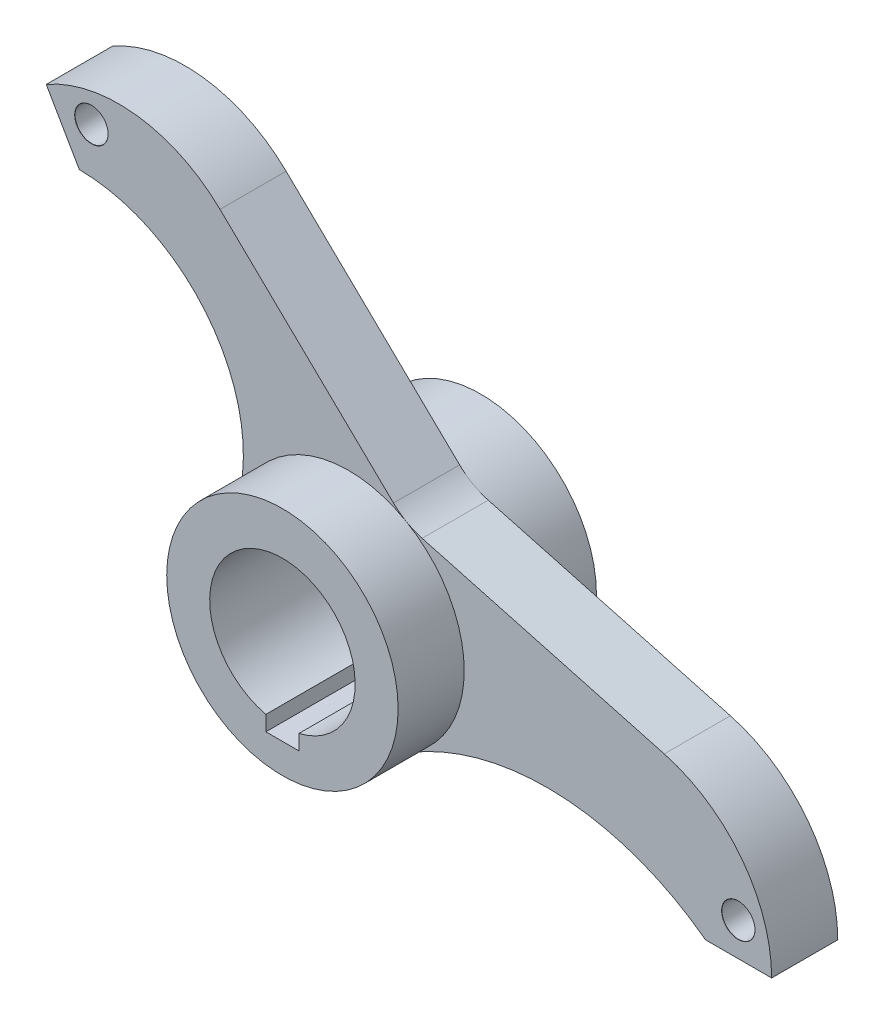
ISO-10303-21;
HEADER;
FILE_DESCRIPTION(('STEP AP214'),'2;1');
FILE_NAME('part.step','',(''),(''),'','','');
FILE_SCHEMA(('AUTOMOTIVE_DESIGN { 1 0 10303 214 1 1 1 1 }'));
ENDSEC;
DATA;
#1=APPLICATION_CONTEXT('core data for automotive mechanical design processes');
#2=APPLICATION_PROTOCOL_DEFINITION('international standard','automotive_design',2000,#1);
#3=PRODUCT_CONTEXT('',#1,'mechanical');
#4=PRODUCT('Part','Part','',(#3));
#5=PRODUCT_RELATED_PRODUCT_CATEGORY('part','',(#4));
#6=PRODUCT_DEFINITION_FORMATION('','',#4);
#7=PRODUCT_DEFINITION_CONTEXT('part definition',#1,'design');
#8=PRODUCT_DEFINITION('design','',#6,#7);
#9=PRODUCT_DEFINITION_SHAPE('','',#8);
#10=(LENGTH_UNIT() NAMED_UNIT(*) SI_UNIT(.MILLI.,.METRE.));
#11=(NAMED_UNIT(*) PLANE_ANGLE_UNIT() SI_UNIT($,.RADIAN.));
#12=(NAMED_UNIT(*) SI_UNIT($,.STERADIAN.) SOLID_ANGLE_UNIT());
#13=UNCERTAINTY_MEASURE_WITH_UNIT(LENGTH_MEASURE(1.E-05),#10,'distance_accuracy_value','');
#14=(GEOMETRIC_REPRESENTATION_CONTEXT(3) GLOBAL_UNCERTAINTY_ASSIGNED_CONTEXT((#13)) GLOBAL_UNIT_ASSIGNED_CONTEXT((#10,
#11,#12)) REPRESENTATION_CONTEXT('',''));
#15=CARTESIAN_POINT('',(0.,0.,0.));
#16=DIRECTION('',(0.,0.,1.));
#17=DIRECTION('',(1.,0.,0.));
#18=AXIS2_PLACEMENT_3D('',#15,#16,#17);
#19=CARTESIAN_POINT('',(0.,0.,15.));
#20=DIRECTION('',(0.,0.,-1.));
#21=DIRECTION('',(-1.,0.,0.));
#22=AXIS2_PLACEMENT_3D('',#19,#20,#21);
#23=CYLINDRICAL_SURFACE('',#22,11.);
#24=CARTESIAN_POINT('',(0.,0.,-15.));
#25=DIRECTION('',(0.,0.,1.));
#26=DIRECTION('',(1.,0.,0.));
#27=AXIS2_PLACEMENT_3D('',#24,#25,#26);
#28=CIRCLE('',#27,11.);
#29=CARTESIAN_POINT('',(2.5,-10.7121426428143,-15.));
#30=VERTEX_POINT('',#29);
#31=CARTESIAN_POINT('',(-2.5,-10.7121426428143,-15.));
#32=VERTEX_POINT('',#31);
#33=EDGE_CURVE('E308',#30,#32,#28,.T.);
#34=ORIENTED_EDGE('',*,*,#33,.F.);
#35=DIRECTION('',(0.,0.,-1.));
#36=VECTOR('',#35,1.);
#37=CARTESIAN_POINT('',(2.5,-10.7121426428143,15.));
#38=LINE('',#37,#36);
#39=CARTESIAN_POINT('',(2.5,-10.7121426428143,15.));
#40=VERTEX_POINT('',#39);
#41=EDGE_CURVE('E12',#40,#30,#38,.T.);
#42=ORIENTED_EDGE('',*,*,#41,.F.);
#43=CARTESIAN_POINT('',(0.,0.,15.));
#44=DIRECTION('',(0.,0.,1.));
#45=DIRECTION('',(1.,0.,0.));
#46=AXIS2_PLACEMENT_3D('',#43,#44,#45);
#47=CIRCLE('',#46,11.);
#48=CARTESIAN_POINT('',(-2.5,-10.7121426428143,15.));
#49=VERTEX_POINT('',#48);
#50=EDGE_CURVE('E309',#40,#49,#47,.T.);
#51=ORIENTED_EDGE('',*,*,#50,.T.);
#52=DIRECTION('',(0.,0.,-1.));
#53=VECTOR('',#52,1.);
#54=CARTESIAN_POINT('',(-2.5,-10.7121426428143,15.));
#55=LINE('',#54,#53);
#56=EDGE_CURVE('E328',#49,#32,#55,.T.);
#57=ORIENTED_EDGE('',*,*,#56,.T.);
#58=EDGE_LOOP('',(#34,#42,#51,#57));
#59=FACE_BOUND('',#58,.T.);
#60=ADVANCED_FACE('F81',(#59),#23,.F.);
#61=CARTESIAN_POINT('',(2.5,0.,15.));
#62=DIRECTION('',(1.,0.,0.));
#63=DIRECTION('',(0.,1.,0.));
#64=AXIS2_PLACEMENT_3D('',#61,#62,#63);
#65=PLANE('',#64);
#66=DIRECTION('',(0.,-1.,0.));
#67=VECTOR('',#66,1.);
#68=CARTESIAN_POINT('',(2.5,0.,-15.));
#69=LINE('',#68,#67);
#70=CARTESIAN_POINT('',(2.5,-13.,-15.));
#71=VERTEX_POINT('',#70);
#72=EDGE_CURVE('E332',#30,#71,#69,.T.);
#73=ORIENTED_EDGE('',*,*,#72,.T.);
#74=DIRECTION('',(0.,0.,-1.));
#75=VECTOR('',#74,1.);
#76=CARTESIAN_POINT('',(2.5,-13.,15.));
#77=LINE('',#76,#75);
#78=CARTESIAN_POINT('',(2.5,-13.,15.));
#79=VERTEX_POINT('',#78);
#80=EDGE_CURVE('E89',#79,#71,#77,.T.);
#81=ORIENTED_EDGE('',*,*,#80,.F.);
#82=DIRECTION('',(0.,-1.,0.));
#83=VECTOR('',#82,1.);
#84=CARTESIAN_POINT('',(2.5,0.,15.));
#85=LINE('',#84,#83);
#86=EDGE_CURVE('E313',#40,#79,#85,.T.);
#87=ORIENTED_EDGE('',*,*,#86,.F.);
#88=ORIENTED_EDGE('',*,*,#41,.T.);
#89=EDGE_LOOP('',(#73,#81,#87,#88));
#90=FACE_BOUND('',#89,.T.);
#91=ADVANCED_FACE('F360',(#90),#65,.F.);
#92=CARTESIAN_POINT('',(0.,-13.,15.));
#93=DIRECTION('',(0.,1.,0.));
#94=DIRECTION('',(0.,0.,1.));
#95=AXIS2_PLACEMENT_3D('',#92,#93,#94);
#96=PLANE('',#95);
#97=DIRECTION('',(1.,0.,0.));
#98=VECTOR('',#97,1.);
#99=CARTESIAN_POINT('',(0.,-13.,-15.));
#100=LINE('',#99,#98);
#101=CARTESIAN_POINT('',(-2.5,-13.,-15.));
#102=VERTEX_POINT('',#101);
#103=EDGE_CURVE('E336',#102,#71,#100,.T.);
#104=ORIENTED_EDGE('',*,*,#103,.F.);
#105=DIRECTION('',(0.,0.,-1.));
#106=VECTOR('',#105,1.);
#107=CARTESIAN_POINT('',(-2.5,-13.,15.));
#108=LINE('',#107,#106);
#109=CARTESIAN_POINT('',(-2.5,-13.,15.));
#110=VERTEX_POINT('',#109);
#111=EDGE_CURVE('E349',#110,#102,#108,.T.);
#112=ORIENTED_EDGE('',*,*,#111,.F.);
#113=DIRECTION('',(1.,0.,0.));
#114=VECTOR('',#113,1.);
#115=CARTESIAN_POINT('',(0.,-13.,15.));
#116=LINE('',#115,#114);
#117=EDGE_CURVE('E317',#110,#79,#116,.T.);
#118=ORIENTED_EDGE('',*,*,#117,.T.);
#119=ORIENTED_EDGE('',*,*,#80,.T.);
#120=EDGE_LOOP('',(#104,#112,#118,#119));
#121=FACE_BOUND('',#120,.T.);
#122=ADVANCED_FACE('F355',(#121),#96,.T.);
#123=CARTESIAN_POINT('',(-2.5,0.,15.));
#124=DIRECTION('',(-1.,0.,0.));
#125=DIRECTION('',(0.,0.,1.));
#126=AXIS2_PLACEMENT_3D('',#123,#124,#125);
#127=PLANE('',#126);
#128=DIRECTION('',(0.,1.,0.));
#129=VECTOR('',#128,1.);
#130=CARTESIAN_POINT('',(-2.5,0.,-15.));
#131=LINE('',#130,#129);
#132=EDGE_CURVE('E340',#102,#32,#131,.T.);
#133=ORIENTED_EDGE('',*,*,#132,.T.);
#134=ORIENTED_EDGE('',*,*,#56,.F.);
#135=DIRECTION('',(0.,1.,0.));
#136=VECTOR('',#135,1.);
#137=CARTESIAN_POINT('',(-2.5,0.,15.));
#138=LINE('',#137,#136);
#139=EDGE_CURVE('E321',#110,#49,#138,.T.);
#140=ORIENTED_EDGE('',*,*,#139,.F.);
#141=ORIENTED_EDGE('',*,*,#111,.T.);
#142=EDGE_LOOP('',(#133,#134,#140,#141));
#143=FACE_BOUND('',#142,.T.);
#144=ADVANCED_FACE('F368',(#143),#127,.F.);
#145=CARTESIAN_POINT('',(0.,0.,15.));
#146=DIRECTION('',(0.,0.,-1.));
#147=DIRECTION('',(-1.,0.,0.));
#148=AXIS2_PLACEMENT_3D('',#145,#146,#147);
#149=CYLINDRICAL_SURFACE('',#148,17.5);
#150=DIRECTION('',(0.,0.,-1.));
#151=VECTOR('',#150,1.);
#152=CARTESIAN_POINT('',(9.14240644268216,-14.9220107370556,5.));
#153=LINE('',#152,#151);
#154=CARTESIAN_POINT('',(9.14240644268216,-14.9220107370556,5.));
#155=VERTEX_POINT('',#154);
#156=CARTESIAN_POINT('',(9.14240644268216,-14.9220107370556,-5.));
#157=VERTEX_POINT('',#156);
#158=EDGE_CURVE('E190',#155,#157,#153,.T.);
#159=ORIENTED_EDGE('',*,*,#158,.F.);
#160=CARTESIAN_POINT('',(0.,0.,5.));
#161=DIRECTION('',(0.,0.,1.));
#162=DIRECTION('',(1.,0.,0.));
#163=AXIS2_PLACEMENT_3D('',#160,#161,#162);
#164=CIRCLE('',#163,17.5);
#165=CARTESIAN_POINT('',(8.75000000000007,15.1554445662276,5.));
#166=VERTEX_POINT('',#165);
#167=EDGE_CURVE('E231',#155,#166,#164,.T.);
#168=ORIENTED_EDGE('',*,*,#167,.T.);
#169=CARTESIAN_POINT('',(0.,0.,5.));
#170=DIRECTION('',(0.,0.,1.));
#171=DIRECTION('',(1.,0.,0.));
#172=AXIS2_PLACEMENT_3D('',#169,#170,#171);
#173=CIRCLE('',#172,17.5);
#174=CARTESIAN_POINT('',(-16.8432257727851,4.74928895383173,5.));
#175=VERTEX_POINT('',#174);
#176=EDGE_CURVE('E96',#166,#175,#173,.T.);
#177=ORIENTED_EDGE('',*,*,#176,.T.);
#178=DIRECTION('',(0.,0.,-1.));
#179=VECTOR('',#178,1.);
#180=CARTESIAN_POINT('',(-16.8432257727851,4.74928895383172,5.));
#181=LINE('',#180,#179);
#182=CARTESIAN_POINT('',(-16.8432257727851,4.74928895383172,-5.));
#183=VERTEX_POINT('',#182);
#184=EDGE_CURVE('E273',#175,#183,#181,.T.);
#185=ORIENTED_EDGE('',*,*,#184,.T.);
#186=CARTESIAN_POINT('',(0.,0.,-5.));
#187=DIRECTION('',(0.,0.,1.));
#188=DIRECTION('',(1.,0.,0.));
#189=AXIS2_PLACEMENT_3D('',#186,#187,#188);
#190=CIRCLE('',#189,17.5);
#191=CARTESIAN_POINT('',(8.75000000000007,15.1554445662276,-5.));
#192=VERTEX_POINT('',#191);
#193=EDGE_CURVE('E209',#192,#183,#190,.T.);
#194=ORIENTED_EDGE('',*,*,#193,.F.);
#195=CARTESIAN_POINT('',(0.,0.,-5.));
#196=DIRECTION('',(0.,0.,1.));
#197=DIRECTION('',(1.,0.,0.));
#198=AXIS2_PLACEMENT_3D('',#195,#196,#197);
#199=CIRCLE('',#198,17.5);
#200=EDGE_CURVE('E104',#157,#192,#199,.T.);
#201=ORIENTED_EDGE('',*,*,#200,.F.);
#202=EDGE_LOOP('',(#159,#168,#177,#185,#194,#201));
#203=FACE_BOUND('',#202,.T.);
#204=CARTESIAN_POINT('',(0.,0.,15.));
#205=DIRECTION('',(0.,0.,1.));
#206=DIRECTION('',(1.,0.,0.));
#207=AXIS2_PLACEMENT_3D('',#204,#205,#206);
#208=CIRCLE('',#207,17.5);
#209=CARTESIAN_POINT('',(17.5,0.,15.));
#210=VERTEX_POINT('',#209);
#211=EDGE_CURVE('E324',#210,#210,#208,.T.);
#212=ORIENTED_EDGE('',*,*,#211,.F.);
#213=EDGE_LOOP('',(#212));
#214=FACE_BOUND('',#213,.T.);
#215=CARTESIAN_POINT('',(0.,0.,-15.));
#216=DIRECTION('',(0.,0.,1.));
#217=DIRECTION('',(1.,0.,0.));
#218=AXIS2_PLACEMENT_3D('',#215,#216,#217);
#219=CIRCLE('',#218,17.5);
#220=CARTESIAN_POINT('',(17.5,0.,-15.));
#221=VERTEX_POINT('',#220);
#222=EDGE_CURVE('E314',#221,#221,#219,.T.);
#223=ORIENTED_EDGE('',*,*,#222,.T.);
#224=EDGE_LOOP('',(#223));
#225=FACE_BOUND('',#224,.T.);
#226=ADVANCED_FACE('F206',(#203,#214,#225),#149,.T.);
#227=CARTESIAN_POINT('',(0.,0.,15.));
#228=DIRECTION('',(0.,0.,1.));
#229=DIRECTION('',(1.,0.,0.));
#230=AXIS2_PLACEMENT_3D('',#227,#228,#229);
#231=PLANE('',#230);
#232=ORIENTED_EDGE('',*,*,#50,.F.);
#233=ORIENTED_EDGE('',*,*,#86,.T.);
#234=ORIENTED_EDGE('',*,*,#117,.F.);
#235=ORIENTED_EDGE('',*,*,#139,.T.);
#236=EDGE_LOOP('',(#232,#233,#234,#235));
#237=FACE_BOUND('',#236,.T.);
#238=ORIENTED_EDGE('',*,*,#211,.T.);
#239=EDGE_LOOP('',(#238));
#240=FACE_BOUND('',#239,.T.);
#241=ADVANCED_FACE('F372',(#237,#240),#231,.T.);
#242=CARTESIAN_POINT('',(0.,0.,-15.));
#243=DIRECTION('',(0.,0.,1.));
#244=DIRECTION('',(1.,0.,0.));
#245=AXIS2_PLACEMENT_3D('',#242,#243,#244);
#246=PLANE('',#245);
#247=ORIENTED_EDGE('',*,*,#33,.T.);
#248=ORIENTED_EDGE('',*,*,#132,.F.);
#249=ORIENTED_EDGE('',*,*,#103,.T.);
#250=ORIENTED_EDGE('',*,*,#72,.F.);
#251=EDGE_LOOP('',(#247,#248,#249,#250));
#252=FACE_BOUND('',#251,.T.);
#253=ORIENTED_EDGE('',*,*,#222,.F.);
#254=EDGE_LOOP('',(#253));
#255=FACE_BOUND('',#254,.T.);
#256=ADVANCED_FACE('F364',(#252,#255),#246,.F.);
#257=CARTESIAN_POINT('',(13.7500000000001,23.815698604072,5.));
#258=DIRECTION('',(0.,0.,-1.));
#259=DIRECTION('',(-1.,0.,0.));
#260=AXIS2_PLACEMENT_3D('',#257,#258,#259);
#261=CYLINDRICAL_SURFACE('',#260,10.);
#262=CARTESIAN_POINT('',(13.7500000000001,23.815698604072,-5.));
#263=DIRECTION('',(0.,0.,1.));
#264=DIRECTION('',(1.,0.,0.));
#265=AXIS2_PLACEMENT_3D('',#262,#263,#264);
#266=CIRCLE('',#265,10.);
#267=CARTESIAN_POINT('',(6.80323629447198,16.6224744299233,-5.));
#268=VERTEX_POINT('',#267);
#269=EDGE_CURVE('E222',#268,#192,#266,.T.);
#270=ORIENTED_EDGE('',*,*,#269,.F.);
#271=DIRECTION('',(0.,0.,-1.));
#272=VECTOR('',#271,1.);
#273=CARTESIAN_POINT('',(6.80323629447198,16.6224744299233,5.));
#274=LINE('',#273,#272);
#275=CARTESIAN_POINT('',(6.80323629447198,16.6224744299233,5.));
#276=VERTEX_POINT('',#275);
#277=EDGE_CURVE('E305',#276,#268,#274,.T.);
#278=ORIENTED_EDGE('',*,*,#277,.F.);
#279=CARTESIAN_POINT('',(13.7500000000001,23.815698604072,5.));
#280=DIRECTION('',(0.,0.,1.));
#281=DIRECTION('',(1.,0.,0.));
#282=AXIS2_PLACEMENT_3D('',#279,#280,#281);
#283=CIRCLE('',#282,10.);
#284=EDGE_CURVE('E252',#276,#166,#283,.T.);
#285=ORIENTED_EDGE('',*,*,#284,.T.);
#286=CARTESIAN_POINT('',(13.7500000000001,23.815698604072,5.));
#287=DIRECTION('',(0.,0.,1.));
#288=DIRECTION('',(1.,0.,0.));
#289=AXIS2_PLACEMENT_3D('',#286,#287,#288);
#290=CIRCLE('',#289,10.);
#291=CARTESIAN_POINT('',(11.1329448993698,14.1642208622821,5.));
#292=VERTEX_POINT('',#291);
#293=EDGE_CURVE('E236',#166,#292,#290,.T.);
#294=ORIENTED_EDGE('',*,*,#293,.T.);
#295=DIRECTION('',(0.,0.,-1.));
#296=VECTOR('',#295,1.);
#297=CARTESIAN_POINT('',(11.1329448993698,14.1642208622821,5.));
#298=LINE('',#297,#296);
#299=CARTESIAN_POINT('',(11.1329448993698,14.1642208622821,-5.));
#300=VERTEX_POINT('',#299);
#301=EDGE_CURVE('E235',#292,#300,#298,.T.);
#302=ORIENTED_EDGE('',*,*,#301,.T.);
#303=CARTESIAN_POINT('',(13.7500000000001,23.815698604072,-5.));
#304=DIRECTION('',(0.,0.,1.));
#305=DIRECTION('',(1.,0.,0.));
#306=AXIS2_PLACEMENT_3D('',#303,#304,#305);
#307=CIRCLE('',#306,10.);
#308=EDGE_CURVE('E212',#192,#300,#307,.T.);
#309=ORIENTED_EDGE('',*,*,#308,.F.);
#310=EDGE_LOOP('',(#270,#278,#285,#294,#302,#309));
#311=FACE_BOUND('',#310,.T.);
#312=ADVANCED_FACE('F390',(#311),#261,.F.);
#313=CARTESIAN_POINT('',(11.5892622621874,12.0004314237111,5.));
#314=DIRECTION('',(0.694676370552813,0.719322417414869,0.));
#315=DIRECTION('',(-0.719322417414869,0.694676370552813,0.));
#316=AXIS2_PLACEMENT_3D('',#313,#314,#315);
#317=PLANE('',#316);
#318=DIRECTION('',(0.719322417414869,-0.694676370552813,0.));
#319=VECTOR('',#318,1.);
#320=CARTESIAN_POINT('',(11.5892622621874,12.0004314237111,-5.));
#321=LINE('',#320,#319);
#322=CARTESIAN_POINT('',(-19.4395517121735,41.9661093345048,-5.));
#323=VERTEX_POINT('',#322);
#324=EDGE_CURVE('E276',#323,#268,#321,.T.);
#325=ORIENTED_EDGE('',*,*,#324,.F.);
#326=DIRECTION('',(0.,0.,-1.));
#327=VECTOR('',#326,1.);
#328=CARTESIAN_POINT('',(-19.4395517121735,41.9661093345048,5.));
#329=LINE('',#328,#327);
#330=CARTESIAN_POINT('',(-19.4395517121735,41.9661093345048,5.));
#331=VERTEX_POINT('',#330);
#332=EDGE_CURVE('E302',#331,#323,#329,.T.);
#333=ORIENTED_EDGE('',*,*,#332,.F.);
#334=DIRECTION('',(0.719322417414869,-0.694676370552813,0.));
#335=VECTOR('',#334,1.);
#336=CARTESIAN_POINT('',(11.5892622621874,12.0004314237111,5.));
#337=LINE('',#336,#335);
#338=EDGE_CURVE('E256',#331,#276,#337,.T.);
#339=ORIENTED_EDGE('',*,*,#338,.T.);
#340=ORIENTED_EDGE('',*,*,#277,.T.);
#341=EDGE_LOOP('',(#325,#333,#339,#340));
#342=FACE_BOUND('',#341,.T.);
#343=ADVANCED_FACE('F395',(#342),#317,.T.);
#344=CARTESIAN_POINT('',(-34.7224318643354,26.1410161513776,5.));
#345=DIRECTION('',(0.,0.,-1.));
#346=DIRECTION('',(-1.,0.,0.));
#347=AXIS2_PLACEMENT_3D('',#344,#345,#346);
#348=CYLINDRICAL_SURFACE('',#347,22.);
#349=CARTESIAN_POINT('',(-34.7224318643354,26.1410161513776,-5.));
#350=DIRECTION('',(0.,0.,1.));
#351=DIRECTION('',(1.,0.,0.));
#352=AXIS2_PLACEMENT_3D('',#349,#350,#351);
#353=CIRCLE('',#352,22.);
#354=CARTESIAN_POINT('',(-45.7224318643353,45.1935750346353,-5.));
#355=VERTEX_POINT('',#354);
#356=EDGE_CURVE('E280',#355,#323,#353,.F.);
#357=ORIENTED_EDGE('',*,*,#356,.F.);
#358=DIRECTION('',(0.,0.,-1.));
#359=VECTOR('',#358,1.);
#360=CARTESIAN_POINT('',(-45.7224318643353,45.1935750346353,5.));
#361=LINE('',#360,#359);
#362=CARTESIAN_POINT('',(-45.7224318643353,45.1935750346353,5.));
#363=VERTEX_POINT('',#362);
#364=EDGE_CURVE('E299',#363,#355,#361,.T.);
#365=ORIENTED_EDGE('',*,*,#364,.F.);
#366=CARTESIAN_POINT('',(-34.7224318643354,26.1410161513776,5.));
#367=DIRECTION('',(0.,0.,1.));
#368=DIRECTION('',(1.,0.,0.));
#369=AXIS2_PLACEMENT_3D('',#366,#367,#368);
#370=CIRCLE('',#369,22.);
#371=EDGE_CURVE('E260',#363,#331,#370,.F.);
#372=ORIENTED_EDGE('',*,*,#371,.T.);
#373=ORIENTED_EDGE('',*,*,#332,.T.);
#374=EDGE_LOOP('',(#357,#365,#372,#373));
#375=FACE_BOUND('',#374,.T.);
#376=ADVANCED_FACE('F399',(#375),#348,.T.);
#377=CARTESIAN_POINT('',(-14.7224318643355,-8.49999999999996,5.));
#378=DIRECTION('',(-0.86602540378444,-0.499999999999998,0.));
#379=DIRECTION('',(0.499999999999998,-0.86602540378444,0.));
#380=AXIS2_PLACEMENT_3D('',#377,#378,#379);
#381=PLANE('',#380);
#382=DIRECTION('',(-0.499999999999998,0.86602540378444,0.));
#383=VECTOR('',#382,1.);
#384=CARTESIAN_POINT('',(-14.7224318643355,-8.49999999999996,-5.));
#385=LINE('',#384,#383);
#386=CARTESIAN_POINT('',(-40.7224318643354,36.5333209967909,-5.));
#387=VERTEX_POINT('',#386);
#388=EDGE_CURVE('E284',#387,#355,#385,.T.);
#389=ORIENTED_EDGE('',*,*,#388,.F.);
#390=DIRECTION('',(0.,0.,-1.));
#391=VECTOR('',#390,1.);
#392=CARTESIAN_POINT('',(-40.7224318643354,36.5333209967909,5.));
#393=LINE('',#392,#391);
#394=CARTESIAN_POINT('',(-40.7224318643354,36.5333209967909,5.));
#395=VERTEX_POINT('',#394);
#396=EDGE_CURVE('E296',#395,#387,#393,.T.);
#397=ORIENTED_EDGE('',*,*,#396,.F.);
#398=DIRECTION('',(-0.499999999999998,0.86602540378444,0.));
#399=VECTOR('',#398,1.);
#400=CARTESIAN_POINT('',(-14.7224318643355,-8.49999999999996,5.));
#401=LINE('',#400,#399);
#402=EDGE_CURVE('E264',#395,#363,#401,.T.);
#403=ORIENTED_EDGE('',*,*,#402,.T.);
#404=ORIENTED_EDGE('',*,*,#364,.T.);
#405=EDGE_LOOP('',(#389,#397,#403,#404));
#406=FACE_BOUND('',#405,.T.);
#407=ADVANCED_FACE('F403',(#406),#381,.T.);
#408=CARTESIAN_POINT('',(-40.9049768767638,11.5339874593056,5.));
#409=DIRECTION('',(0.,0.,-1.));
#410=DIRECTION('',(-1.,0.,0.));
#411=AXIS2_PLACEMENT_3D('',#408,#409,#410);
#412=CYLINDRICAL_SURFACE('',#411,25.);
#413=CARTESIAN_POINT('',(-40.9049768767638,11.5339874593056,-5.));
#414=DIRECTION('',(0.,0.,1.));
#415=DIRECTION('',(1.,0.,0.));
#416=AXIS2_PLACEMENT_3D('',#413,#414,#415);
#417=CIRCLE('',#416,25.);
#418=EDGE_CURVE('E288',#387,#183,#417,.F.);
#419=ORIENTED_EDGE('',*,*,#418,.T.);
#420=ORIENTED_EDGE('',*,*,#184,.F.);
#421=CARTESIAN_POINT('',(-40.9049768767638,11.5339874593056,5.));
#422=DIRECTION('',(0.,0.,1.));
#423=DIRECTION('',(1.,0.,0.));
#424=AXIS2_PLACEMENT_3D('',#421,#422,#423);
#425=CIRCLE('',#424,25.);
#426=EDGE_CURVE('E268',#395,#175,#425,.F.);
#427=ORIENTED_EDGE('',*,*,#426,.F.);
#428=ORIENTED_EDGE('',*,*,#396,.T.);
#429=EDGE_LOOP('',(#419,#420,#427,#428));
#430=FACE_BOUND('',#429,.T.);
#431=ADVANCED_FACE('F407',(#430),#412,.F.);
#432=CARTESIAN_POINT('',(0.,0.,5.));
#433=DIRECTION('',(0.,0.,1.));
#434=DIRECTION('',(1.,0.,0.));
#435=AXIS2_PLACEMENT_3D('',#432,#433,#434);
#436=PLANE('',#435);
#437=CARTESIAN_POINT('',(-38.8923355989284,43.363541782112,5.));
#438=DIRECTION('',(0.,0.,1.));
#439=DIRECTION('',(1.,0.,0.));
#440=AXIS2_PLACEMENT_3D('',#437,#438,#439);
#441=CIRCLE('',#440,2.525);
#442=CARTESIAN_POINT('',(-36.3673355989284,43.363541782112,5.));
#443=VERTEX_POINT('',#442);
#444=EDGE_CURVE('E464',#443,#443,#441,.T.);
#445=ORIENTED_EDGE('',*,*,#444,.F.);
#446=EDGE_LOOP('',(#445));
#447=FACE_BOUND('',#446,.T.);
#448=ORIENTED_EDGE('',*,*,#284,.F.);
#449=ORIENTED_EDGE('',*,*,#338,.F.);
#450=ORIENTED_EDGE('',*,*,#371,.F.);
#451=ORIENTED_EDGE('',*,*,#402,.F.);
#452=ORIENTED_EDGE('',*,*,#426,.T.);
#453=ORIENTED_EDGE('',*,*,#176,.F.);
#454=EDGE_LOOP('',(#448,#449,#450,#451,#452,#453));
#455=FACE_BOUND('',#454,.T.);
#456=ADVANCED_FACE('F411',(#447,#455),#436,.T.);
#457=CARTESIAN_POINT('',(0.,0.,-5.));
#458=DIRECTION('',(0.,0.,1.));
#459=DIRECTION('',(1.,0.,0.));
#460=AXIS2_PLACEMENT_3D('',#457,#458,#459);
#461=PLANE('',#460);
#462=CARTESIAN_POINT('',(-38.8923355989284,43.363541782112,-5.));
#463=DIRECTION('',(0.,0.,1.));
#464=DIRECTION('',(1.,0.,0.));
#465=AXIS2_PLACEMENT_3D('',#462,#463,#464);
#466=CIRCLE('',#465,2.5);
#467=CARTESIAN_POINT('',(-36.3923355989284,43.363541782112,-5.));
#468=VERTEX_POINT('',#467);
#469=EDGE_CURVE('E468',#468,#468,#466,.T.);
#470=ORIENTED_EDGE('',*,*,#469,.T.);
#471=EDGE_LOOP('',(#470));
#472=FACE_BOUND('',#471,.T.);
#473=ORIENTED_EDGE('',*,*,#269,.T.);
#474=ORIENTED_EDGE('',*,*,#193,.T.);
#475=ORIENTED_EDGE('',*,*,#418,.F.);
#476=ORIENTED_EDGE('',*,*,#388,.T.);
#477=ORIENTED_EDGE('',*,*,#356,.T.);
#478=ORIENTED_EDGE('',*,*,#324,.T.);
#479=EDGE_LOOP('',(#473,#474,#475,#476,#477,#478));
#480=FACE_BOUND('',#479,.T.);
#481=ADVANCED_FACE('F413',(#472,#480),#461,.F.);
#482=CARTESIAN_POINT('',(30.0393354545271,-49.0294638503257,5.));
#483=DIRECTION('',(0.,0.,-1.));
#484=DIRECTION('',(-1.,0.,0.));
#485=AXIS2_PLACEMENT_3D('',#482,#483,#484);
#486=CYLINDRICAL_SURFACE('',#485,40.);
#487=CARTESIAN_POINT('',(30.0393354545271,-49.0294638503257,-5.));
#488=DIRECTION('',(0.,0.,1.));
#489=DIRECTION('',(1.,0.,0.));
#490=AXIS2_PLACEMENT_3D('',#487,#488,#489);
#491=CIRCLE('',#490,40.);
#492=CARTESIAN_POINT('',(54.,-17.,-5.));
#493=VERTEX_POINT('',#492);
#494=EDGE_CURVE('E192',#493,#157,#491,.T.);
#495=ORIENTED_EDGE('',*,*,#494,.F.);
#496=DIRECTION('',(0.,0.,-1.));
#497=VECTOR('',#496,1.);
#498=CARTESIAN_POINT('',(54.,-17.,5.));
#499=LINE('',#498,#497);
#500=CARTESIAN_POINT('',(54.,-17.,5.));
#501=VERTEX_POINT('',#500);
#502=EDGE_CURVE('E228',#501,#493,#499,.T.);
#503=ORIENTED_EDGE('',*,*,#502,.F.);
#504=CARTESIAN_POINT('',(30.0393354545271,-49.0294638503257,5.));
#505=DIRECTION('',(0.,0.,1.));
#506=DIRECTION('',(1.,0.,0.));
#507=AXIS2_PLACEMENT_3D('',#504,#505,#506);
#508=CIRCLE('',#507,40.);
#509=EDGE_CURVE('E194',#501,#155,#508,.T.);
#510=ORIENTED_EDGE('',*,*,#509,.T.);
#511=ORIENTED_EDGE('',*,*,#158,.T.);
#512=EDGE_LOOP('',(#495,#503,#510,#511));
#513=FACE_BOUND('',#512,.T.);
#514=ADVANCED_FACE('F191',(#513),#486,.F.);
#515=CARTESIAN_POINT('',(0.,-17.,5.));
#516=DIRECTION('',(0.,1.,0.));
#517=DIRECTION('',(0.,0.,1.));
#518=AXIS2_PLACEMENT_3D('',#515,#516,#517);
#519=PLANE('',#518);
#520=DIRECTION('',(1.,0.,0.));
#521=VECTOR('',#520,1.);
#522=CARTESIAN_POINT('',(0.,-17.,-5.));
#523=LINE('',#522,#521);
#524=CARTESIAN_POINT('',(64.,-17.,-5.));
#525=VERTEX_POINT('',#524);
#526=EDGE_CURVE('E197',#493,#525,#523,.T.);
#527=ORIENTED_EDGE('',*,*,#526,.T.);
#528=DIRECTION('',(0.,0.,-1.));
#529=VECTOR('',#528,1.);
#530=CARTESIAN_POINT('',(64.,-17.,5.));
#531=LINE('',#530,#529);
#532=CARTESIAN_POINT('',(64.,-17.,5.));
#533=VERTEX_POINT('',#532);
#534=EDGE_CURVE('E227',#533,#525,#531,.T.);
#535=ORIENTED_EDGE('',*,*,#534,.F.);
#536=DIRECTION('',(1.,0.,0.));
#537=VECTOR('',#536,1.);
#538=CARTESIAN_POINT('',(0.,-17.,5.));
#539=LINE('',#538,#537);
#540=EDGE_CURVE('E234',#501,#533,#539,.T.);
#541=ORIENTED_EDGE('',*,*,#540,.F.);
#542=ORIENTED_EDGE('',*,*,#502,.T.);
#543=EDGE_LOOP('',(#527,#535,#541,#542));
#544=FACE_BOUND('',#543,.T.);
#545=ADVANCED_FACE('F435',(#544),#519,.F.);
#546=CARTESIAN_POINT('',(42.,-17.,5.));
#547=DIRECTION('',(0.,0.,-1.));
#548=DIRECTION('',(-1.,0.,0.));
#549=AXIS2_PLACEMENT_3D('',#546,#547,#548);
#550=CYLINDRICAL_SURFACE('',#549,22.);
#551=CARTESIAN_POINT('',(42.,-17.,-5.));
#552=DIRECTION('',(0.,0.,1.));
#553=DIRECTION('',(1.,0.,0.));
#554=AXIS2_PLACEMENT_3D('',#551,#552,#553);
#555=CIRCLE('',#554,22.);
#556=CARTESIAN_POINT('',(47.7575212213866,4.23325103193768,-5.));
#557=VERTEX_POINT('',#556);
#558=EDGE_CURVE('E223',#525,#557,#555,.T.);
#559=ORIENTED_EDGE('',*,*,#558,.T.);
#560=DIRECTION('',(0.,0.,-1.));
#561=VECTOR('',#560,1.);
#562=CARTESIAN_POINT('',(47.7575212213866,4.23325103193768,5.));
#563=LINE('',#562,#561);
#564=CARTESIAN_POINT('',(47.7575212213866,4.23325103193768,5.));
#565=VERTEX_POINT('',#564);
#566=EDGE_CURVE('E240',#565,#557,#563,.T.);
#567=ORIENTED_EDGE('',*,*,#566,.F.);
#568=CARTESIAN_POINT('',(42.,-17.,5.));
#569=DIRECTION('',(0.,0.,1.));
#570=DIRECTION('',(1.,0.,0.));
#571=AXIS2_PLACEMENT_3D('',#568,#569,#570);
#572=CIRCLE('',#571,22.);
#573=EDGE_CURVE('E203',#533,#565,#572,.T.);
#574=ORIENTED_EDGE('',*,*,#573,.F.);
#575=ORIENTED_EDGE('',*,*,#534,.T.);
#576=EDGE_LOOP('',(#559,#567,#574,#575));
#577=FACE_BOUND('',#576,.T.);
#578=ADVANCED_FACE('F431',(#577),#550,.T.);
#579=CARTESIAN_POINT('',(4.34015539030421,16.0061257920563,5.));
#580=DIRECTION('',(0.261705510063026,0.965147774178986,0.));
#581=DIRECTION('',(-0.965147774178986,0.261705510063026,0.));
#582=AXIS2_PLACEMENT_3D('',#579,#580,#581);
#583=PLANE('',#582);
#584=DIRECTION('',(0.965147774178986,-0.261705510063026,0.));
#585=VECTOR('',#584,1.);
#586=CARTESIAN_POINT('',(4.34015539030421,16.0061257920563,-5.));
#587=LINE('',#586,#585);
#588=EDGE_CURVE('E215',#300,#557,#587,.T.);
#589=ORIENTED_EDGE('',*,*,#588,.F.);
#590=ORIENTED_EDGE('',*,*,#301,.F.);
#591=DIRECTION('',(0.965147774178986,-0.261705510063026,0.));
#592=VECTOR('',#591,1.);
#593=CARTESIAN_POINT('',(4.34015539030421,16.0061257920563,5.));
#594=LINE('',#593,#592);
#595=EDGE_CURVE('E241',#292,#565,#594,.T.);
#596=ORIENTED_EDGE('',*,*,#595,.T.);
#597=ORIENTED_EDGE('',*,*,#566,.T.);
#598=EDGE_LOOP('',(#589,#590,#596,#597));
#599=FACE_BOUND('',#598,.T.);
#600=ADVANCED_FACE('F423',(#599),#583,.T.);
#601=CARTESIAN_POINT('',(0.,0.,5.));
#602=DIRECTION('',(0.,0.,1.));
#603=DIRECTION('',(1.,0.,0.));
#604=AXIS2_PLACEMENT_3D('',#601,#602,#603);
#605=PLANE('',#604);
#606=CARTESIAN_POINT('',(58.9561056088804,-11.9547526218538,5.));
#607=DIRECTION('',(0.,0.,1.));
#608=DIRECTION('',(1.,0.,0.));
#609=AXIS2_PLACEMENT_3D('',#606,#607,#608);
#610=CIRCLE('',#609,2.525);
#611=CARTESIAN_POINT('',(61.4811056088804,-11.9547526218538,5.));
#612=VERTEX_POINT('',#611);
#613=EDGE_CURVE('E474',#612,#612,#610,.T.);
#614=ORIENTED_EDGE('',*,*,#613,.F.);
#615=EDGE_LOOP('',(#614));
#616=FACE_BOUND('',#615,.T.);
#617=ORIENTED_EDGE('',*,*,#509,.F.);
#618=ORIENTED_EDGE('',*,*,#540,.T.);
#619=ORIENTED_EDGE('',*,*,#573,.T.);
#620=ORIENTED_EDGE('',*,*,#595,.F.);
#621=ORIENTED_EDGE('',*,*,#293,.F.);
#622=ORIENTED_EDGE('',*,*,#167,.F.);
#623=EDGE_LOOP('',(#617,#618,#619,#620,#621,#622));
#624=FACE_BOUND('',#623,.T.);
#625=ADVANCED_FACE('F420',(#616,#624),#605,.T.);
#626=CARTESIAN_POINT('',(0.,0.,-5.));
#627=DIRECTION('',(0.,0.,1.));
#628=DIRECTION('',(1.,0.,0.));
#629=AXIS2_PLACEMENT_3D('',#626,#627,#628);
#630=PLANE('',#629);
#631=CARTESIAN_POINT('',(58.9561056088804,-11.9547526218538,-5.));
#632=DIRECTION('',(0.,0.,1.));
#633=DIRECTION('',(1.,0.,0.));
#634=AXIS2_PLACEMENT_3D('',#631,#632,#633);
#635=CIRCLE('',#634,2.5);
#636=CARTESIAN_POINT('',(61.4561056088804,-11.9547526218538,-5.));
#637=VERTEX_POINT('',#636);
#638=EDGE_CURVE('E251',#637,#637,#635,.T.);
#639=ORIENTED_EDGE('',*,*,#638,.T.);
#640=EDGE_LOOP('',(#639));
#641=FACE_BOUND('',#640,.T.);
#642=ORIENTED_EDGE('',*,*,#494,.T.);
#643=ORIENTED_EDGE('',*,*,#200,.T.);
#644=ORIENTED_EDGE('',*,*,#308,.T.);
#645=ORIENTED_EDGE('',*,*,#588,.T.);
#646=ORIENTED_EDGE('',*,*,#558,.F.);
#647=ORIENTED_EDGE('',*,*,#526,.F.);
#648=EDGE_LOOP('',(#642,#643,#644,#645,#646,#647));
#649=FACE_BOUND('',#648,.T.);
#650=ADVANCED_FACE('F200',(#641,#649),#630,.F.);
#651=CARTESIAN_POINT('',(58.9561056088804,-11.9547526218538,5.));
#652=DIRECTION('',(0.,0.,1.));
#653=DIRECTION('',(1.,0.,0.));
#654=AXIS2_PLACEMENT_3D('',#651,#652,#653);
#655=CYLINDRICAL_SURFACE('',#654,2.5);
#656=ORIENTED_EDGE('',*,*,#638,.F.);
#657=EDGE_LOOP('',(#656));
#658=FACE_BOUND('',#657,.T.);
#659=CARTESIAN_POINT('',(58.9561056088804,-11.9547526218538,4.975));
#660=DIRECTION('',(0.,0.,1.));
#661=DIRECTION('',(1.,0.,0.));
#662=AXIS2_PLACEMENT_3D('',#659,#660,#661);
#663=CIRCLE('',#662,2.5);
#664=CARTESIAN_POINT('',(61.4561056088804,-11.9547526218538,4.975));
#665=VERTEX_POINT('',#664);
#666=EDGE_CURVE('E478',#665,#665,#663,.T.);
#667=ORIENTED_EDGE('',*,*,#666,.T.);
#668=EDGE_LOOP('',(#667));
#669=FACE_BOUND('',#668,.T.);
#670=ADVANCED_FACE('F427',(#658,#669),#655,.F.);
#671=CARTESIAN_POINT('',(58.9561056088804,-11.9547526218538,5.));
#672=DIRECTION('',(0.,0.,1.));
#673=DIRECTION('',(1.,0.,0.));
#674=AXIS2_PLACEMENT_3D('',#671,#672,#673);
#675=CONICAL_SURFACE('',#674,2.525,0.785398163397379);
#676=ORIENTED_EDGE('',*,*,#666,.F.);
#677=EDGE_LOOP('',(#676));
#678=FACE_BOUND('',#677,.T.);
#679=ORIENTED_EDGE('',*,*,#613,.T.);
#680=EDGE_LOOP('',(#679));
#681=FACE_BOUND('',#680,.T.);
#682=ADVANCED_FACE('F444',(#678,#681),#675,.F.);
#683=CARTESIAN_POINT('',(-38.8923355989284,43.363541782112,5.));
#684=DIRECTION('',(0.,0.,1.));
#685=DIRECTION('',(1.,0.,0.));
#686=AXIS2_PLACEMENT_3D('',#683,#684,#685);
#687=CYLINDRICAL_SURFACE('',#686,2.5);
#688=ORIENTED_EDGE('',*,*,#469,.F.);
#689=EDGE_LOOP('',(#688));
#690=FACE_BOUND('',#689,.T.);
#691=CARTESIAN_POINT('',(-38.8923355989284,43.363541782112,4.975));
#692=DIRECTION('',(0.,0.,1.));
#693=DIRECTION('',(1.,0.,0.));
#694=AXIS2_PLACEMENT_3D('',#691,#692,#693);
#695=CIRCLE('',#694,2.5);
#696=CARTESIAN_POINT('',(-36.3923355989284,43.363541782112,4.975));
#697=VERTEX_POINT('',#696);
#698=EDGE_CURVE('E461',#697,#697,#695,.T.);
#699=ORIENTED_EDGE('',*,*,#698,.T.);
#700=EDGE_LOOP('',(#699));
#701=FACE_BOUND('',#700,.T.);
#702=ADVANCED_FACE('F448',(#690,#701),#687,.F.);
#703=CARTESIAN_POINT('',(-38.8923355989284,43.363541782112,5.));
#704=DIRECTION('',(0.,0.,1.));
#705=DIRECTION('',(1.,0.,0.));
#706=AXIS2_PLACEMENT_3D('',#703,#704,#705);
#707=CONICAL_SURFACE('',#706,2.525,0.785398163397379);
#708=ORIENTED_EDGE('',*,*,#698,.F.);
#709=EDGE_LOOP('',(#708));
#710=FACE_BOUND('',#709,.T.);
#711=ORIENTED_EDGE('',*,*,#444,.T.);
#712=EDGE_LOOP('',(#711));
#713=FACE_BOUND('',#712,.T.);
#714=ADVANCED_FACE('F452',(#710,#713),#707,.F.);
#715=CLOSED_SHELL('',(#60,#91,#122,#144,#226,#241,#256,#312,#343,#376,#407,#431,#456,#481,#514,
#545,#578,#600,#625,#650,#670,#682,#702,#714));
#716=MANIFOLD_SOLID_BREP('B2',#715);
#717=ADVANCED_BREP_SHAPE_REPRESENTATION('',(#18,#716),#14);
#718=SHAPE_DEFINITION_REPRESENTATION(#9,#717);
ENDSEC;
END-ISO-10303-21;
